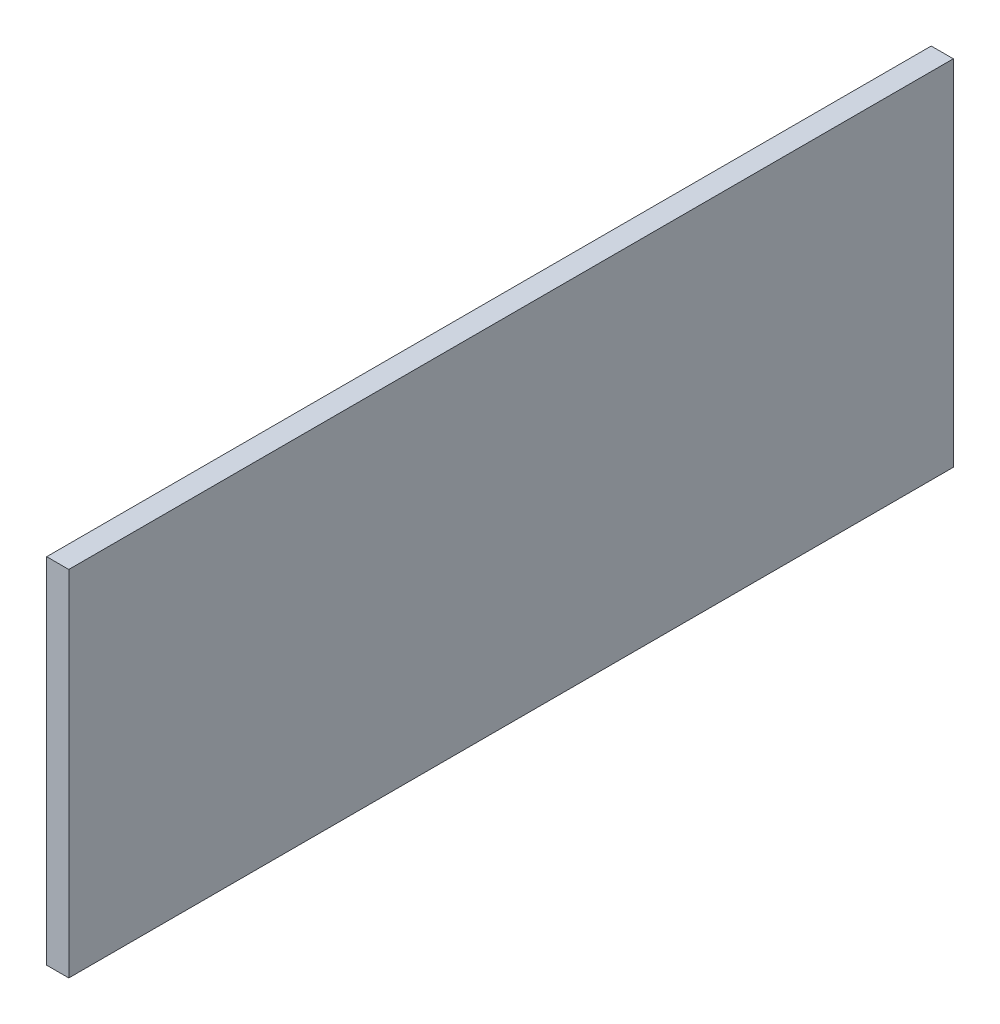
ISO-10303-21;
HEADER;
FILE_DESCRIPTION(('STEP AP214'),'2;1');
FILE_NAME('part.step','',(''),(''),'','','');
FILE_SCHEMA(('AUTOMOTIVE_DESIGN { 1 0 10303 214 1 1 1 1 }'));
ENDSEC;
DATA;
#1=APPLICATION_CONTEXT('core data for automotive mechanical design processes');
#2=APPLICATION_PROTOCOL_DEFINITION('international standard','automotive_design',2000,#1);
#3=PRODUCT_CONTEXT('',#1,'mechanical');
#4=PRODUCT('Part','Part','',(#3));
#5=PRODUCT_RELATED_PRODUCT_CATEGORY('part','',(#4));
#6=PRODUCT_DEFINITION_FORMATION('','',#4);
#7=PRODUCT_DEFINITION_CONTEXT('part definition',#1,'design');
#8=PRODUCT_DEFINITION('design','',#6,#7);
#9=PRODUCT_DEFINITION_SHAPE('','',#8);
#10=(LENGTH_UNIT() NAMED_UNIT(*) SI_UNIT(.MILLI.,.METRE.));
#11=(NAMED_UNIT(*) PLANE_ANGLE_UNIT() SI_UNIT($,.RADIAN.));
#12=(NAMED_UNIT(*) SI_UNIT($,.STERADIAN.) SOLID_ANGLE_UNIT());
#13=UNCERTAINTY_MEASURE_WITH_UNIT(LENGTH_MEASURE(1.E-05),#10,'distance_accuracy_value','');
#14=(GEOMETRIC_REPRESENTATION_CONTEXT(3) GLOBAL_UNCERTAINTY_ASSIGNED_CONTEXT((#13)) GLOBAL_UNIT_ASSIGNED_CONTEXT((#10,
#11,#12)) REPRESENTATION_CONTEXT('',''));
#15=CARTESIAN_POINT('',(0.,0.,0.));
#16=DIRECTION('',(0.,0.,1.));
#17=DIRECTION('',(1.,0.,0.));
#18=AXIS2_PLACEMENT_3D('',#15,#16,#17);
#19=CARTESIAN_POINT('',(-2.49999999999999,80.,-100.));
#20=DIRECTION('',(1.,0.,0.));
#21=DIRECTION('',(0.,0.,-1.));
#22=AXIS2_PLACEMENT_3D('',#19,#20,#21);
#23=PLANE('',#22);
#24=DIRECTION('',(0.,0.,1.));
#25=VECTOR('',#24,1.);
#26=CARTESIAN_POINT('',(-2.49999999999999,0.,-100.));
#27=LINE('',#26,#25);
#28=CARTESIAN_POINT('',(-2.49999999999999,0.,-100.));
#29=VERTEX_POINT('',#28);
#30=CARTESIAN_POINT('',(-2.49999999999996,0.,100.));
#31=VERTEX_POINT('',#30);
#32=EDGE_CURVE('E96',#29,#31,#27,.T.);
#33=ORIENTED_EDGE('',*,*,#32,.T.);
#34=DIRECTION('',(0.,-1.,0.));
#35=VECTOR('',#34,1.);
#36=CARTESIAN_POINT('',(-2.49999999999996,80.,100.));
#37=LINE('',#36,#35);
#38=CARTESIAN_POINT('',(-2.49999999999996,80.,100.));
#39=VERTEX_POINT('',#38);
#40=EDGE_CURVE('E11',#39,#31,#37,.T.);
#41=ORIENTED_EDGE('',*,*,#40,.F.);
#42=DIRECTION('',(0.,0.,1.));
#43=VECTOR('',#42,1.);
#44=CARTESIAN_POINT('',(-2.49999999999999,80.,-100.));
#45=LINE('',#44,#43);
#46=CARTESIAN_POINT('',(-2.49999999999999,80.,-100.));
#47=VERTEX_POINT('',#46);
#48=EDGE_CURVE('E84',#47,#39,#45,.T.);
#49=ORIENTED_EDGE('',*,*,#48,.F.);
#50=DIRECTION('',(0.,-1.,0.));
#51=VECTOR('',#50,1.);
#52=CARTESIAN_POINT('',(-2.49999999999999,80.,-100.));
#53=LINE('',#52,#51);
#54=EDGE_CURVE('E92',#47,#29,#53,.T.);
#55=ORIENTED_EDGE('',*,*,#54,.T.);
#56=EDGE_LOOP('',(#33,#41,#49,#55));
#57=FACE_BOUND('',#56,.T.);
#58=ADVANCED_FACE('F33',(#57),#23,.F.);
#59=CARTESIAN_POINT('',(-2.49999999999996,80.,100.));
#60=DIRECTION('',(0.,0.,-1.));
#61=DIRECTION('',(-1.,0.,0.));
#62=AXIS2_PLACEMENT_3D('',#59,#60,#61);
#63=PLANE('',#62);
#64=DIRECTION('',(1.,0.,0.));
#65=VECTOR('',#64,1.);
#66=CARTESIAN_POINT('',(-2.49999999999996,0.,100.));
#67=LINE('',#66,#65);
#68=CARTESIAN_POINT('',(2.50000000000004,0.,100.));
#69=VERTEX_POINT('',#68);
#70=EDGE_CURVE('E88',#31,#69,#67,.T.);
#71=ORIENTED_EDGE('',*,*,#70,.T.);
#72=DIRECTION('',(0.,-1.,0.));
#73=VECTOR('',#72,1.);
#74=CARTESIAN_POINT('',(2.50000000000004,80.,100.));
#75=LINE('',#74,#73);
#76=CARTESIAN_POINT('',(2.50000000000004,80.,100.));
#77=VERTEX_POINT('',#76);
#78=EDGE_CURVE('E41',#77,#69,#75,.T.);
#79=ORIENTED_EDGE('',*,*,#78,.F.);
#80=DIRECTION('',(1.,0.,0.));
#81=VECTOR('',#80,1.);
#82=CARTESIAN_POINT('',(-2.49999999999996,80.,100.));
#83=LINE('',#82,#81);
#84=EDGE_CURVE('E79',#39,#77,#83,.T.);
#85=ORIENTED_EDGE('',*,*,#84,.F.);
#86=ORIENTED_EDGE('',*,*,#40,.T.);
#87=EDGE_LOOP('',(#71,#79,#85,#86));
#88=FACE_BOUND('',#87,.T.);
#89=ADVANCED_FACE('F87',(#88),#63,.F.);
#90=CARTESIAN_POINT('',(2.50000000000001,80.,-100.));
#91=DIRECTION('',(-1.,0.,0.));
#92=DIRECTION('',(0.,0.,1.));
#93=AXIS2_PLACEMENT_3D('',#90,#91,#92);
#94=PLANE('',#93);
#95=DIRECTION('',(0.,0.,-1.));
#96=VECTOR('',#95,1.);
#97=CARTESIAN_POINT('',(2.50000000000001,0.,-100.));
#98=LINE('',#97,#96);
#99=CARTESIAN_POINT('',(2.50000000000001,0.,-100.));
#100=VERTEX_POINT('',#99);
#101=EDGE_CURVE('E66',#69,#100,#98,.T.);
#102=ORIENTED_EDGE('',*,*,#101,.T.);
#103=DIRECTION('',(0.,-1.,0.));
#104=VECTOR('',#103,1.);
#105=CARTESIAN_POINT('',(2.50000000000001,80.,-100.));
#106=LINE('',#105,#104);
#107=CARTESIAN_POINT('',(2.50000000000001,80.,-100.));
#108=VERTEX_POINT('',#107);
#109=EDGE_CURVE('E89',#108,#100,#106,.T.);
#110=ORIENTED_EDGE('',*,*,#109,.F.);
#111=DIRECTION('',(0.,0.,-1.));
#112=VECTOR('',#111,1.);
#113=CARTESIAN_POINT('',(2.50000000000001,80.,-100.));
#114=LINE('',#113,#112);
#115=EDGE_CURVE('E82',#77,#108,#114,.T.);
#116=ORIENTED_EDGE('',*,*,#115,.F.);
#117=ORIENTED_EDGE('',*,*,#78,.T.);
#118=EDGE_LOOP('',(#102,#110,#116,#117));
#119=FACE_BOUND('',#118,.T.);
#120=ADVANCED_FACE('F90',(#119),#94,.F.);
#121=CARTESIAN_POINT('',(-2.49999999999999,80.,-100.));
#122=DIRECTION('',(0.,0.,1.));
#123=DIRECTION('',(1.,0.,0.));
#124=AXIS2_PLACEMENT_3D('',#121,#122,#123);
#125=PLANE('',#124);
#126=DIRECTION('',(-1.,0.,0.));
#127=VECTOR('',#126,1.);
#128=CARTESIAN_POINT('',(-2.49999999999999,0.,-100.));
#129=LINE('',#128,#127);
#130=EDGE_CURVE('E72',#100,#29,#129,.T.);
#131=ORIENTED_EDGE('',*,*,#130,.T.);
#132=ORIENTED_EDGE('',*,*,#54,.F.);
#133=DIRECTION('',(-1.,0.,0.));
#134=VECTOR('',#133,1.);
#135=CARTESIAN_POINT('',(-2.49999999999999,80.,-100.));
#136=LINE('',#135,#134);
#137=EDGE_CURVE('E49',#108,#47,#136,.T.);
#138=ORIENTED_EDGE('',*,*,#137,.F.);
#139=ORIENTED_EDGE('',*,*,#109,.T.);
#140=EDGE_LOOP('',(#131,#132,#138,#139));
#141=FACE_BOUND('',#140,.T.);
#142=ADVANCED_FACE('F103',(#141),#125,.F.);
#143=CARTESIAN_POINT('',(0.,80.,0.));
#144=DIRECTION('',(0.,1.,0.));
#145=DIRECTION('',(0.,0.,1.));
#146=AXIS2_PLACEMENT_3D('',#143,#144,#145);
#147=PLANE('',#146);
#148=ORIENTED_EDGE('',*,*,#48,.T.);
#149=ORIENTED_EDGE('',*,*,#84,.T.);
#150=ORIENTED_EDGE('',*,*,#115,.T.);
#151=ORIENTED_EDGE('',*,*,#137,.T.);
#152=EDGE_LOOP('',(#148,#149,#150,#151));
#153=FACE_BOUND('',#152,.T.);
#154=ADVANCED_FACE('F80',(#153),#147,.T.);
#155=CARTESIAN_POINT('',(0.,0.,0.));
#156=DIRECTION('',(0.,1.,0.));
#157=DIRECTION('',(0.,0.,1.));
#158=AXIS2_PLACEMENT_3D('',#155,#156,#157);
#159=PLANE('',#158);
#160=ORIENTED_EDGE('',*,*,#32,.F.);
#161=ORIENTED_EDGE('',*,*,#130,.F.);
#162=ORIENTED_EDGE('',*,*,#101,.F.);
#163=ORIENTED_EDGE('',*,*,#70,.F.);
#164=EDGE_LOOP('',(#160,#161,#162,#163));
#165=FACE_BOUND('',#164,.T.);
#166=ADVANCED_FACE('F106',(#165),#159,.F.);
#167=CLOSED_SHELL('',(#58,#89,#120,#142,#154,#166));
#168=MANIFOLD_SOLID_BREP('B2',#167);
#169=ADVANCED_BREP_SHAPE_REPRESENTATION('',(#18,#168),#14);
#170=SHAPE_DEFINITION_REPRESENTATION(#9,#169);
ENDSEC;
END-ISO-10303-21;
